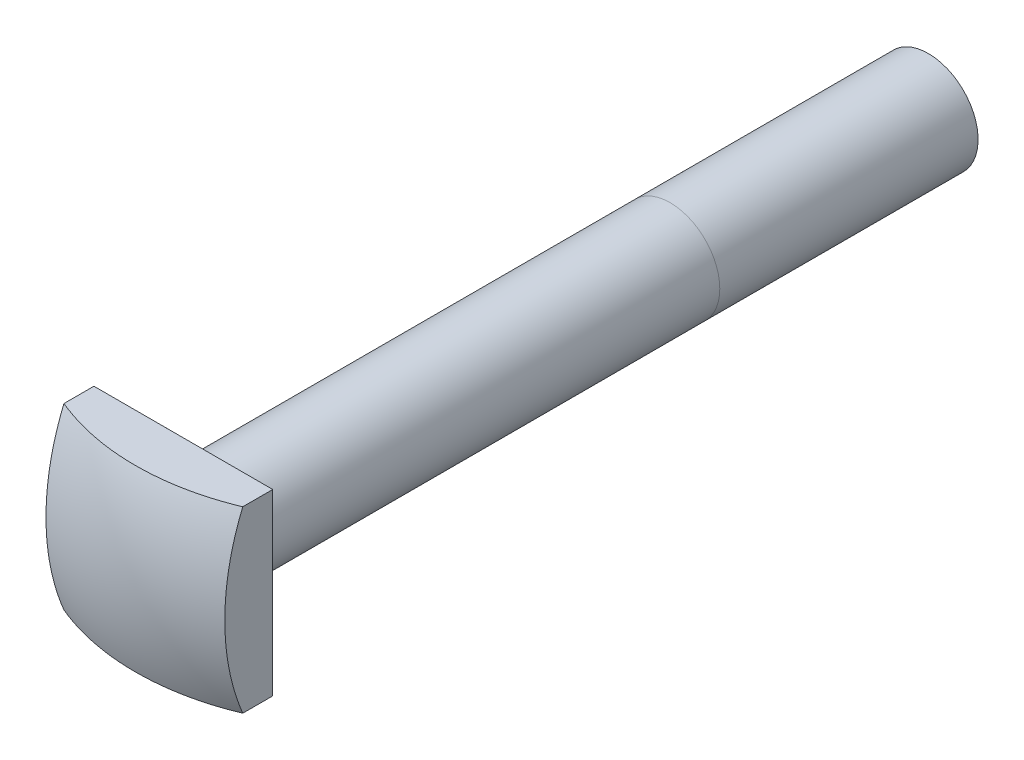
ISO-10303-21;
HEADER;
FILE_DESCRIPTION(('STEP AP214'),'2;1');
FILE_NAME('part.step','',(''),(''),'','','');
FILE_SCHEMA(('AUTOMOTIVE_DESIGN { 1 0 10303 214 1 1 1 1 }'));
ENDSEC;
DATA;
#1=APPLICATION_CONTEXT('core data for automotive mechanical design processes');
#2=APPLICATION_PROTOCOL_DEFINITION('international standard','automotive_design',2000,#1);
#3=PRODUCT_CONTEXT('',#1,'mechanical');
#4=PRODUCT('Part','Part','',(#3));
#5=PRODUCT_RELATED_PRODUCT_CATEGORY('part','',(#4));
#6=PRODUCT_DEFINITION_FORMATION('','',#4);
#7=PRODUCT_DEFINITION_CONTEXT('part definition',#1,'design');
#8=PRODUCT_DEFINITION('design','',#6,#7);
#9=PRODUCT_DEFINITION_SHAPE('','',#8);
#10=(LENGTH_UNIT() NAMED_UNIT(*) SI_UNIT(.MILLI.,.METRE.));
#11=(NAMED_UNIT(*) PLANE_ANGLE_UNIT() SI_UNIT($,.RADIAN.));
#12=(NAMED_UNIT(*) SI_UNIT($,.STERADIAN.) SOLID_ANGLE_UNIT());
#13=UNCERTAINTY_MEASURE_WITH_UNIT(LENGTH_MEASURE(1.E-05),#10,'distance_accuracy_value','');
#14=(GEOMETRIC_REPRESENTATION_CONTEXT(3) GLOBAL_UNCERTAINTY_ASSIGNED_CONTEXT((#13)) GLOBAL_UNIT_ASSIGNED_CONTEXT((#10,
#11,#12)) REPRESENTATION_CONTEXT('',''));
#15=CARTESIAN_POINT('',(0.,0.,0.));
#16=DIRECTION('',(0.,0.,1.));
#17=DIRECTION('',(1.,0.,0.));
#18=AXIS2_PLACEMENT_3D('',#15,#16,#17);
#19=CARTESIAN_POINT('',(0.,0.,-75.));
#20=DIRECTION('',(0.,0.,1.));
#21=DIRECTION('',(1.,0.,0.));
#22=AXIS2_PLACEMENT_3D('',#19,#20,#21);
#23=CYLINDRICAL_SURFACE('',#22,5.);
#24=CARTESIAN_POINT('',(0.,0.,0.));
#25=DIRECTION('',(0.,0.,-1.));
#26=DIRECTION('',(-1.,0.,0.));
#27=AXIS2_PLACEMENT_3D('',#24,#25,#26);
#28=CIRCLE('',#27,5.);
#29=CARTESIAN_POINT('',(-5.,0.,0.));
#30=VERTEX_POINT('',#29);
#31=EDGE_CURVE('E97',#30,#30,#28,.T.);
#32=ORIENTED_EDGE('',*,*,#31,.T.);
#33=EDGE_LOOP('',(#32));
#34=FACE_BOUND('',#33,.T.);
#35=CARTESIAN_POINT('',(0.,0.,-49.));
#36=DIRECTION('',(0.,0.,-1.));
#37=DIRECTION('',(-1.,0.,0.));
#38=AXIS2_PLACEMENT_3D('',#35,#36,#37);
#39=CIRCLE('',#38,5.);
#40=CARTESIAN_POINT('',(-5.,0.,-49.));
#41=VERTEX_POINT('',#40);
#42=CARTESIAN_POINT('',(5.,0.,-49.));
#43=VERTEX_POINT('',#42);
#44=EDGE_CURVE('E11',#41,#43,#39,.T.);
#45=ORIENTED_EDGE('',*,*,#44,.F.);
#46=EDGE_CURVE('E46',#43,#41,#39,.T.);
#47=ORIENTED_EDGE('',*,*,#46,.F.);
#48=EDGE_LOOP('',(#45,#47));
#49=FACE_BOUND('',#48,.T.);
#50=ADVANCED_FACE('F42',(#34,#49),#23,.T.);
#51=CARTESIAN_POINT('',(9.,-9.,6.5));
#52=DIRECTION('',(-1.,0.,0.));
#53=DIRECTION('',(0.,0.,1.));
#54=AXIS2_PLACEMENT_3D('',#51,#52,#53);
#55=PLANE('',#54);
#56=DIRECTION('',(0.,0.,-1.));
#57=VECTOR('',#56,1.);
#58=CARTESIAN_POINT('',(9.,9.,6.5));
#59=LINE('',#58,#57);
#60=CARTESIAN_POINT('',(8.99999999999999,9.,3.01743479135002));
#61=VERTEX_POINT('',#60);
#62=CARTESIAN_POINT('',(9.,9.,0.));
#63=VERTEX_POINT('',#62);
#64=EDGE_CURVE('E103',#61,#63,#59,.T.);
#65=ORIENTED_EDGE('',*,*,#64,.F.);
#66=CARTESIAN_POINT('',(8.99999999999999,0.,-18.5));
#67=DIRECTION('',(-1.,0.,0.));
#68=DIRECTION('',(0.,0.,1.));
#69=AXIS2_PLACEMENT_3D('',#66,#67,#68);
#70=CIRCLE('',#69,23.3238075793812);
#71=CARTESIAN_POINT('',(8.99999999999999,-9.,3.01743479135002));
#72=VERTEX_POINT('',#71);
#73=EDGE_CURVE('E90',#61,#72,#70,.F.);
#74=ORIENTED_EDGE('',*,*,#73,.T.);
#75=DIRECTION('',(0.,0.,-1.));
#76=VECTOR('',#75,1.);
#77=CARTESIAN_POINT('',(9.,-9.,6.5));
#78=LINE('',#77,#76);
#79=CARTESIAN_POINT('',(9.,-9.,0.));
#80=VERTEX_POINT('',#79);
#81=EDGE_CURVE('E101',#72,#80,#78,.T.);
#82=ORIENTED_EDGE('',*,*,#81,.T.);
#83=DIRECTION('',(0.,1.,0.));
#84=VECTOR('',#83,1.);
#85=CARTESIAN_POINT('',(9.,-9.,0.));
#86=LINE('',#85,#84);
#87=EDGE_CURVE('E129',#80,#63,#86,.T.);
#88=ORIENTED_EDGE('',*,*,#87,.T.);
#89=EDGE_LOOP('',(#65,#74,#82,#88));
#90=FACE_BOUND('',#89,.T.);
#91=ADVANCED_FACE('F44',(#90),#55,.F.);
#92=CARTESIAN_POINT('',(-9.,9.,6.5));
#93=DIRECTION('',(0.,-1.,0.));
#94=DIRECTION('',(0.,0.,-1.));
#95=AXIS2_PLACEMENT_3D('',#92,#93,#94);
#96=PLANE('',#95);
#97=DIRECTION('',(0.,0.,-1.));
#98=VECTOR('',#97,1.);
#99=CARTESIAN_POINT('',(-9.,9.,6.5));
#100=LINE('',#99,#98);
#101=CARTESIAN_POINT('',(-9.,9.,3.01743479135002));
#102=VERTEX_POINT('',#101);
#103=CARTESIAN_POINT('',(-9.,9.,0.));
#104=VERTEX_POINT('',#103);
#105=EDGE_CURVE('E113',#102,#104,#100,.T.);
#106=ORIENTED_EDGE('',*,*,#105,.F.);
#107=CARTESIAN_POINT('',(0.,9.,-18.5));
#108=DIRECTION('',(0.,-1.,0.));
#109=DIRECTION('',(0.,0.,-1.));
#110=AXIS2_PLACEMENT_3D('',#107,#108,#109);
#111=CIRCLE('',#110,23.3238075793812);
#112=EDGE_CURVE('E105',#102,#61,#111,.F.);
#113=ORIENTED_EDGE('',*,*,#112,.T.);
#114=ORIENTED_EDGE('',*,*,#64,.T.);
#115=DIRECTION('',(-1.,0.,0.));
#116=VECTOR('',#115,1.);
#117=CARTESIAN_POINT('',(-9.,9.,0.));
#118=LINE('',#117,#116);
#119=EDGE_CURVE('E131',#63,#104,#118,.T.);
#120=ORIENTED_EDGE('',*,*,#119,.T.);
#121=EDGE_LOOP('',(#106,#113,#114,#120));
#122=FACE_BOUND('',#121,.T.);
#123=ADVANCED_FACE('F139',(#122),#96,.F.);
#124=CARTESIAN_POINT('',(-9.,-9.,6.5));
#125=DIRECTION('',(1.,0.,0.));
#126=DIRECTION('',(0.,0.,-1.));
#127=AXIS2_PLACEMENT_3D('',#124,#125,#126);
#128=PLANE('',#127);
#129=DIRECTION('',(0.,0.,-1.));
#130=VECTOR('',#129,1.);
#131=CARTESIAN_POINT('',(-9.,-9.,6.5));
#132=LINE('',#131,#130);
#133=CARTESIAN_POINT('',(-9.,-9.,3.01743479135002));
#134=VERTEX_POINT('',#133);
#135=CARTESIAN_POINT('',(-9.,-9.,0.));
#136=VERTEX_POINT('',#135);
#137=EDGE_CURVE('E111',#134,#136,#132,.T.);
#138=ORIENTED_EDGE('',*,*,#137,.F.);
#139=CARTESIAN_POINT('',(-9.,0.,-18.5));
#140=DIRECTION('',(1.,0.,0.));
#141=DIRECTION('',(0.,0.,-1.));
#142=AXIS2_PLACEMENT_3D('',#139,#140,#141);
#143=CIRCLE('',#142,23.3238075793812);
#144=EDGE_CURVE('E93',#134,#102,#143,.F.);
#145=ORIENTED_EDGE('',*,*,#144,.T.);
#146=ORIENTED_EDGE('',*,*,#105,.T.);
#147=DIRECTION('',(0.,-1.,0.));
#148=VECTOR('',#147,1.);
#149=CARTESIAN_POINT('',(-9.,-9.,0.));
#150=LINE('',#149,#148);
#151=EDGE_CURVE('E115',#104,#136,#150,.T.);
#152=ORIENTED_EDGE('',*,*,#151,.T.);
#153=EDGE_LOOP('',(#138,#145,#146,#152));
#154=FACE_BOUND('',#153,.T.);
#155=ADVANCED_FACE('F135',(#154),#128,.F.);
#156=CARTESIAN_POINT('',(-9.,-9.,6.5));
#157=DIRECTION('',(0.,1.,0.));
#158=DIRECTION('',(0.,0.,1.));
#159=AXIS2_PLACEMENT_3D('',#156,#157,#158);
#160=PLANE('',#159);
#161=ORIENTED_EDGE('',*,*,#81,.F.);
#162=CARTESIAN_POINT('',(0.,-9.,-18.5));
#163=DIRECTION('',(0.,1.,0.));
#164=DIRECTION('',(0.,0.,1.));
#165=AXIS2_PLACEMENT_3D('',#162,#163,#164);
#166=CIRCLE('',#165,23.3238075793812);
#167=EDGE_CURVE('E87',#72,#134,#166,.F.);
#168=ORIENTED_EDGE('',*,*,#167,.T.);
#169=ORIENTED_EDGE('',*,*,#137,.T.);
#170=DIRECTION('',(1.,0.,0.));
#171=VECTOR('',#170,1.);
#172=CARTESIAN_POINT('',(-9.,-9.,0.));
#173=LINE('',#172,#171);
#174=EDGE_CURVE('E109',#136,#80,#173,.T.);
#175=ORIENTED_EDGE('',*,*,#174,.T.);
#176=EDGE_LOOP('',(#161,#168,#169,#175));
#177=FACE_BOUND('',#176,.T.);
#178=ADVANCED_FACE('F107',(#177),#160,.F.);
#179=CARTESIAN_POINT('',(0.,0.,0.));
#180=DIRECTION('',(0.,0.,-1.));
#181=DIRECTION('',(-1.,0.,0.));
#182=AXIS2_PLACEMENT_3D('',#179,#180,#181);
#183=PLANE('',#182);
#184=ORIENTED_EDGE('',*,*,#31,.F.);
#185=EDGE_LOOP('',(#184));
#186=FACE_BOUND('',#185,.T.);
#187=ORIENTED_EDGE('',*,*,#87,.F.);
#188=ORIENTED_EDGE('',*,*,#174,.F.);
#189=ORIENTED_EDGE('',*,*,#151,.F.);
#190=ORIENTED_EDGE('',*,*,#119,.F.);
#191=EDGE_LOOP('',(#187,#188,#189,#190));
#192=FACE_BOUND('',#191,.T.);
#193=ADVANCED_FACE('F138',(#186,#192),#183,.T.);
#194=ORIENTED_EDGE('',*,*,#46,.T.);
#195=ORIENTED_EDGE('',*,*,#44,.T.);
#196=EDGE_LOOP('',(#194,#195));
#197=FACE_BOUND('',#196,.T.);
#198=CARTESIAN_POINT('',(0.,0.,-75.));
#199=DIRECTION('',(0.,0.,-1.));
#200=DIRECTION('',(-1.,0.,0.));
#201=AXIS2_PLACEMENT_3D('',#198,#199,#200);
#202=CIRCLE('',#201,5.);
#203=CARTESIAN_POINT('',(-5.,0.,-75.));
#204=VERTEX_POINT('',#203);
#205=EDGE_CURVE('E104',#204,#204,#202,.T.);
#206=ORIENTED_EDGE('',*,*,#205,.F.);
#207=EDGE_LOOP('',(#206));
#208=FACE_BOUND('',#207,.T.);
#209=ADVANCED_FACE('F150',(#197,#208),#23,.T.);
#210=CARTESIAN_POINT('',(0.,0.,-75.));
#211=DIRECTION('',(0.,0.,-1.));
#212=DIRECTION('',(-1.,0.,0.));
#213=AXIS2_PLACEMENT_3D('',#210,#211,#212);
#214=PLANE('',#213);
#215=ORIENTED_EDGE('',*,*,#205,.T.);
#216=EDGE_LOOP('',(#215));
#217=FACE_BOUND('',#216,.T.);
#218=ADVANCED_FACE('F156',(#217),#214,.T.);
#219=CARTESIAN_POINT('',(0.,0.,-18.5));
#220=DIRECTION('',(0.,0.,-1.));
#221=DIRECTION('',(-1.,0.,0.));
#222=AXIS2_PLACEMENT_3D('',#219,#220,#221);
#223=SPHERICAL_SURFACE('',#222,25.);
#224=CARTESIAN_POINT('',(0.,0.,6.5));
#225=VERTEX_POINT('',#224);
#226=VERTEX_LOOP('',#225);
#227=FACE_BOUND('',#226,.T.);
#228=ORIENTED_EDGE('',*,*,#112,.F.);
#229=ORIENTED_EDGE('',*,*,#144,.F.);
#230=ORIENTED_EDGE('',*,*,#167,.F.);
#231=ORIENTED_EDGE('',*,*,#73,.F.);
#232=EDGE_LOOP('',(#228,#229,#230,#231));
#233=FACE_BOUND('',#232,.T.);
#234=ADVANCED_FACE('F89',(#227,#233),#223,.T.);
#235=CLOSED_SHELL('',(#50,#91,#123,#155,#178,#193,#209,#218,#234));
#236=MANIFOLD_SOLID_BREP('B2',#235);
#237=ADVANCED_BREP_SHAPE_REPRESENTATION('',(#18,#236),#14);
#238=SHAPE_DEFINITION_REPRESENTATION(#9,#237);
ENDSEC;
END-ISO-10303-21;
